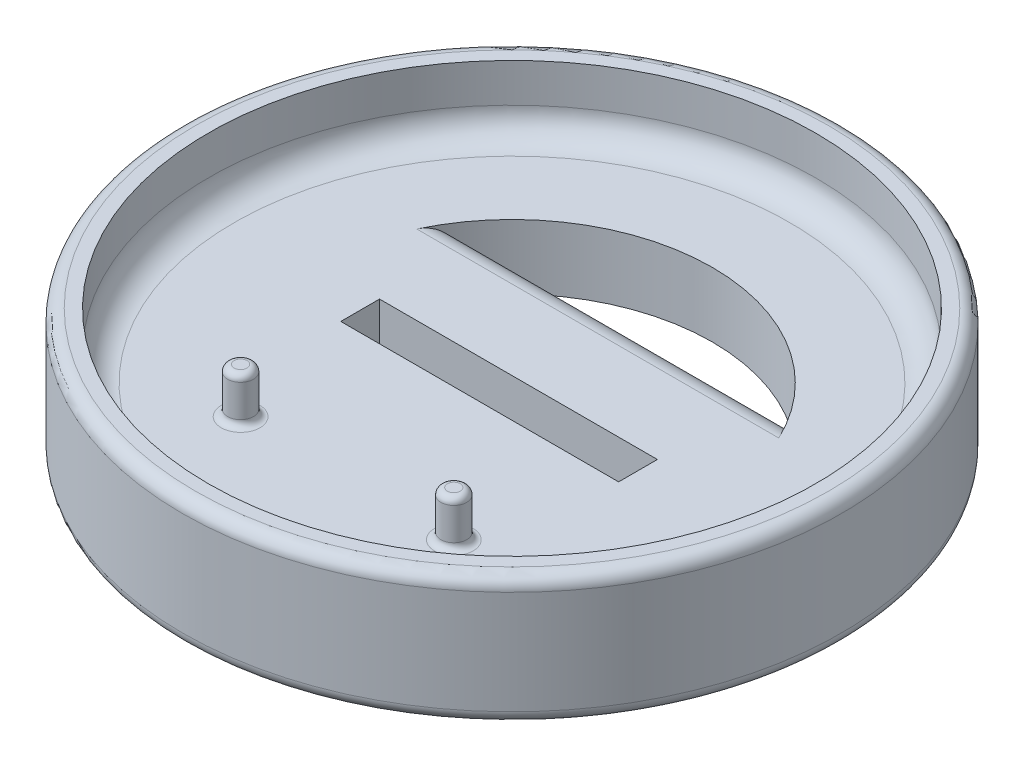
ISO-10303-21;
HEADER;
FILE_DESCRIPTION(('STEP AP214'),'2;1');
FILE_NAME('part.step','',(''),(''),'','','');
FILE_SCHEMA(('AUTOMOTIVE_DESIGN { 1 0 10303 214 1 1 1 1 }'));
ENDSEC;
DATA;
#1=APPLICATION_CONTEXT('core data for automotive mechanical design processes');
#2=APPLICATION_PROTOCOL_DEFINITION('international standard','automotive_design',2000,#1);
#3=PRODUCT_CONTEXT('',#1,'mechanical');
#4=PRODUCT('Part','Part','',(#3));
#5=PRODUCT_RELATED_PRODUCT_CATEGORY('part','',(#4));
#6=PRODUCT_DEFINITION_FORMATION('','',#4);
#7=PRODUCT_DEFINITION_CONTEXT('part definition',#1,'design');
#8=PRODUCT_DEFINITION('design','',#6,#7);
#9=PRODUCT_DEFINITION_SHAPE('','',#8);
#10=(LENGTH_UNIT() NAMED_UNIT(*) SI_UNIT(.MILLI.,.METRE.));
#11=(NAMED_UNIT(*) PLANE_ANGLE_UNIT() SI_UNIT($,.RADIAN.));
#12=(NAMED_UNIT(*) SI_UNIT($,.STERADIAN.) SOLID_ANGLE_UNIT());
#13=UNCERTAINTY_MEASURE_WITH_UNIT(LENGTH_MEASURE(1.E-05),#10,'distance_accuracy_value','');
#14=(GEOMETRIC_REPRESENTATION_CONTEXT(3) GLOBAL_UNCERTAINTY_ASSIGNED_CONTEXT((#13)) GLOBAL_UNIT_ASSIGNED_CONTEXT((#10,
#11,#12)) REPRESENTATION_CONTEXT('',''));
#15=CARTESIAN_POINT('',(0.,0.,0.));
#16=DIRECTION('',(0.,0.,1.));
#17=DIRECTION('',(1.,0.,0.));
#18=AXIS2_PLACEMENT_3D('',#15,#16,#17);
#19=CARTESIAN_POINT('',(0.,5.,0.));
#20=DIRECTION('',(0.,1.,0.));
#21=DIRECTION('',(0.,0.,1.));
#22=AXIS2_PLACEMENT_3D('',#19,#20,#21);
#23=PLANE('',#22);
#24=CARTESIAN_POINT('',(-8.25,5.,12.75));
#25=DIRECTION('',(0.,1.,0.));
#26=DIRECTION('',(0.,0.,1.));
#27=AXIS2_PLACEMENT_3D('',#24,#25,#26);
#28=CIRCLE('',#27,1.5);
#29=CARTESIAN_POINT('',(-8.25,5.,14.25));
#30=VERTEX_POINT('',#29);
#31=EDGE_CURVE('E451',#30,#30,#28,.F.);
#32=ORIENTED_EDGE('',*,*,#31,.T.);
#33=EDGE_LOOP('',(#32));
#34=FACE_BOUND('',#33,.T.);
#35=CARTESIAN_POINT('',(8.25,5.,12.75));
#36=DIRECTION('',(0.,1.,0.));
#37=DIRECTION('',(0.,0.,1.));
#38=AXIS2_PLACEMENT_3D('',#35,#36,#37);
#39=CIRCLE('',#38,1.5);
#40=CARTESIAN_POINT('',(8.25,5.,14.25));
#41=VERTEX_POINT('',#40);
#42=EDGE_CURVE('E446',#41,#41,#39,.F.);
#43=ORIENTED_EDGE('',*,*,#42,.T.);
#44=EDGE_LOOP('',(#43));
#45=FACE_BOUND('',#44,.T.);
#46=CARTESIAN_POINT('',(0.,5.,0.));
#47=DIRECTION('',(0.,1.,0.));
#48=DIRECTION('',(0.,0.,1.));
#49=AXIS2_PLACEMENT_3D('',#46,#47,#48);
#50=CIRCLE('',#49,21.5);
#51=CARTESIAN_POINT('',(0.,5.,21.5));
#52=VERTEX_POINT('',#51);
#53=EDGE_CURVE('E161',#52,#52,#50,.T.);
#54=ORIENTED_EDGE('',*,*,#53,.T.);
#55=EDGE_LOOP('',(#54));
#56=FACE_BOUND('',#55,.T.);
#57=CARTESIAN_POINT('',(0.,5.,0.));
#58=DIRECTION('',(0.,1.,0.));
#59=DIRECTION('',(0.,0.,1.));
#60=AXIS2_PLACEMENT_3D('',#57,#58,#59);
#61=CIRCLE('',#60,15.5);
#62=CARTESIAN_POINT('',(14.0080112419468,5.,-6.6351805586203));
#63=VERTEX_POINT('',#62);
#64=CARTESIAN_POINT('',(-14.0080112419468,5.,-6.6351805586203));
#65=VERTEX_POINT('',#64);
#66=EDGE_CURVE('E146',#63,#65,#61,.T.);
#67=ORIENTED_EDGE('',*,*,#66,.F.);
#68=DIRECTION('',(1.,0.,0.));
#69=VECTOR('',#68,1.);
#70=CARTESIAN_POINT('',(0.,5.,-6.6351805586203));
#71=LINE('',#70,#69);
#72=EDGE_CURVE('E158',#63,#65,#71,.F.);
#73=ORIENTED_EDGE('',*,*,#72,.T.);
#74=EDGE_LOOP('',(#67,#73));
#75=FACE_BOUND('',#74,.T.);
#76=DIRECTION('',(0.,0.,-1.));
#77=VECTOR('',#76,1.);
#78=CARTESIAN_POINT('',(10.75,5.,0.));
#79=LINE('',#78,#77);
#80=CARTESIAN_POINT('',(10.75,5.,2.5));
#81=VERTEX_POINT('',#80);
#82=CARTESIAN_POINT('',(10.75,5.,-0.500000000000001));
#83=VERTEX_POINT('',#82);
#84=EDGE_CURVE('E133',#81,#83,#79,.T.);
#85=ORIENTED_EDGE('',*,*,#84,.F.);
#86=DIRECTION('',(-1.,0.,0.));
#87=VECTOR('',#86,1.);
#88=CARTESIAN_POINT('',(0.,5.,2.5));
#89=LINE('',#88,#87);
#90=CARTESIAN_POINT('',(-10.75,5.,2.5));
#91=VERTEX_POINT('',#90);
#92=EDGE_CURVE('E56',#81,#91,#89,.T.);
#93=ORIENTED_EDGE('',*,*,#92,.T.);
#94=DIRECTION('',(0.,0.,-1.));
#95=VECTOR('',#94,1.);
#96=CARTESIAN_POINT('',(-10.75,5.,0.));
#97=LINE('',#96,#95);
#98=CARTESIAN_POINT('',(-10.75,5.,-0.499999999999998));
#99=VERTEX_POINT('',#98);
#100=EDGE_CURVE('E124',#91,#99,#97,.T.);
#101=ORIENTED_EDGE('',*,*,#100,.T.);
#102=DIRECTION('',(-1.,0.,0.));
#103=VECTOR('',#102,1.);
#104=CARTESIAN_POINT('',(0.,5.,-0.5));
#105=LINE('',#104,#103);
#106=EDGE_CURVE('E127',#83,#99,#105,.T.);
#107=ORIENTED_EDGE('',*,*,#106,.F.);
#108=EDGE_LOOP('',(#85,#93,#101,#107));
#109=FACE_BOUND('',#108,.T.);
#110=ADVANCED_FACE('F41',(#34,#45,#56,#75,#109),#23,.T.);
#111=CARTESIAN_POINT('',(0.,0.,0.));
#112=DIRECTION('',(0.,1.,0.));
#113=DIRECTION('',(0.,0.,1.));
#114=AXIS2_PLACEMENT_3D('',#111,#112,#113);
#115=PLANE('',#114);
#116=CARTESIAN_POINT('',(0.,0.,0.));
#117=DIRECTION('',(0.,1.,0.));
#118=DIRECTION('',(0.,0.,1.));
#119=AXIS2_PLACEMENT_3D('',#116,#117,#118);
#120=CIRCLE('',#119,24.5);
#121=CARTESIAN_POINT('',(0.,0.,24.5));
#122=VERTEX_POINT('',#121);
#123=EDGE_CURVE('E11',#122,#122,#120,.F.);
#124=ORIENTED_EDGE('',*,*,#123,.T.);
#125=EDGE_LOOP('',(#124));
#126=FACE_BOUND('',#125,.T.);
#127=DIRECTION('',(1.,0.,0.));
#128=VECTOR('',#127,1.);
#129=CARTESIAN_POINT('',(12.8718163722151,0.,-6.6351805586203));
#130=LINE('',#129,#128);
#131=CARTESIAN_POINT('',(-14.0080112419468,0.,-6.6351805586203));
#132=VERTEX_POINT('',#131);
#133=CARTESIAN_POINT('',(14.0080112419468,0.,-6.6351805586203));
#134=VERTEX_POINT('',#133);
#135=EDGE_CURVE('E164',#132,#134,#130,.T.);
#136=ORIENTED_EDGE('',*,*,#135,.T.);
#137=CARTESIAN_POINT('',(0.,0.,0.));
#138=DIRECTION('',(0.,1.,0.));
#139=DIRECTION('',(0.,0.,1.));
#140=AXIS2_PLACEMENT_3D('',#137,#138,#139);
#141=CIRCLE('',#140,15.5);
#142=EDGE_CURVE('E145',#134,#132,#141,.T.);
#143=ORIENTED_EDGE('',*,*,#142,.T.);
#144=EDGE_LOOP('',(#136,#143));
#145=FACE_BOUND('',#144,.T.);
#146=DIRECTION('',(-1.,0.,0.));
#147=VECTOR('',#146,1.);
#148=CARTESIAN_POINT('',(0.,0.,2.5));
#149=LINE('',#148,#147);
#150=CARTESIAN_POINT('',(10.75,0.,2.5));
#151=VERTEX_POINT('',#150);
#152=CARTESIAN_POINT('',(-10.75,0.,2.5));
#153=VERTEX_POINT('',#152);
#154=EDGE_CURVE('E109',#151,#153,#149,.T.);
#155=ORIENTED_EDGE('',*,*,#154,.F.);
#156=DIRECTION('',(0.,0.,-1.));
#157=VECTOR('',#156,1.);
#158=CARTESIAN_POINT('',(10.75,0.,0.));
#159=LINE('',#158,#157);
#160=CARTESIAN_POINT('',(10.75,0.,-0.500000000000001));
#161=VERTEX_POINT('',#160);
#162=EDGE_CURVE('E118',#151,#161,#159,.T.);
#163=ORIENTED_EDGE('',*,*,#162,.T.);
#164=DIRECTION('',(-1.,0.,0.));
#165=VECTOR('',#164,1.);
#166=CARTESIAN_POINT('',(0.,0.,-0.5));
#167=LINE('',#166,#165);
#168=CARTESIAN_POINT('',(-10.75,0.,-0.499999999999998));
#169=VERTEX_POINT('',#168);
#170=EDGE_CURVE('E64',#161,#169,#167,.T.);
#171=ORIENTED_EDGE('',*,*,#170,.T.);
#172=DIRECTION('',(0.,0.,-1.));
#173=VECTOR('',#172,1.);
#174=CARTESIAN_POINT('',(-10.75,0.,0.));
#175=LINE('',#174,#173);
#176=EDGE_CURVE('E115',#153,#169,#175,.T.);
#177=ORIENTED_EDGE('',*,*,#176,.F.);
#178=EDGE_LOOP('',(#155,#163,#171,#177));
#179=FACE_BOUND('',#178,.T.);
#180=ADVANCED_FACE('F123',(#126,#145,#179),#115,.F.);
#181=CARTESIAN_POINT('',(0.,5.,-8.6351805586203));
#182=DIRECTION('',(0.,0.,-1.));
#183=DIRECTION('',(-1.,0.,0.));
#184=AXIS2_PLACEMENT_3D('',#181,#182,#183);
#185=PLANE('',#184);
#186=DIRECTION('',(0.,-1.,0.));
#187=VECTOR('',#186,1.);
#188=CARTESIAN_POINT('',(12.8718163722151,5.,-8.6351805586203));
#189=LINE('',#188,#187);
#190=CARTESIAN_POINT('',(12.8718163722151,3.,-8.6351805586203));
#191=VERTEX_POINT('',#190);
#192=CARTESIAN_POINT('',(12.8718163722151,2.,-8.6351805586203));
#193=VERTEX_POINT('',#192);
#194=EDGE_CURVE('E148',#191,#193,#189,.T.);
#195=ORIENTED_EDGE('',*,*,#194,.T.);
#196=DIRECTION('',(1.,0.,0.));
#197=VECTOR('',#196,1.);
#198=CARTESIAN_POINT('',(-12.8718163722151,2.,-8.6351805586203));
#199=LINE('',#198,#197);
#200=CARTESIAN_POINT('',(-12.8718163722151,2.,-8.6351805586203));
#201=VERTEX_POINT('',#200);
#202=EDGE_CURVE('E170',#193,#201,#199,.F.);
#203=ORIENTED_EDGE('',*,*,#202,.T.);
#204=DIRECTION('',(0.,-1.,0.));
#205=VECTOR('',#204,1.);
#206=CARTESIAN_POINT('',(-12.8718163722151,5.,-8.6351805586203));
#207=LINE('',#206,#205);
#208=CARTESIAN_POINT('',(-12.8718163722151,3.,-8.6351805586203));
#209=VERTEX_POINT('',#208);
#210=EDGE_CURVE('E152',#209,#201,#207,.T.);
#211=ORIENTED_EDGE('',*,*,#210,.F.);
#212=DIRECTION('',(1.,0.,0.));
#213=VECTOR('',#212,1.);
#214=CARTESIAN_POINT('',(0.,3.,-8.6351805586203));
#215=LINE('',#214,#213);
#216=EDGE_CURVE('E167',#209,#191,#215,.T.);
#217=ORIENTED_EDGE('',*,*,#216,.T.);
#218=EDGE_LOOP('',(#195,#203,#211,#217));
#219=FACE_BOUND('',#218,.T.);
#220=ADVANCED_FACE('F196',(#219),#185,.T.);
#221=CARTESIAN_POINT('',(0.,5.,0.));
#222=DIRECTION('',(0.,-1.,0.));
#223=DIRECTION('',(0.,0.,-1.));
#224=AXIS2_PLACEMENT_3D('',#221,#222,#223);
#225=CYLINDRICAL_SURFACE('',#224,15.5);
#226=ORIENTED_EDGE('',*,*,#142,.F.);
#227=CARTESIAN_POINT('',(14.0080112419468,0.,-6.6351805586203));
#228=CARTESIAN_POINT('',(13.9781206290154,4.21945147258445E-06,-6.69829090336129));
#229=CARTESIAN_POINT('',(13.9478158055815,0.00298799475050054,-6.76115981054807));
#230=CARTESIAN_POINT('',(13.8865912124818,0.0148015338495115,-6.8860298619537));
#231=CARTESIAN_POINT('',(13.8556715574973,0.0236302171704366,-6.94803116439367));
#232=CARTESIAN_POINT('',(13.7623144733947,0.0587078426554312,-7.13215029882441));
#233=CARTESIAN_POINT('',(13.6992585885515,0.0935485155013303,-7.2524262075691));
#234=CARTESIAN_POINT('',(13.5737999522414,0.185045832755223,-7.48461141225801));
#235=CARTESIAN_POINT('',(13.5113970355795,0.24169681522057,-7.59652287061201));
#236=CARTESIAN_POINT('',(13.3896603213025,0.375897013976576,-7.80909665840873));
#237=CARTESIAN_POINT('',(13.330327787042,0.453454752436903,-7.90975437679276));
#238=CARTESIAN_POINT('',(13.2187450850758,0.626951926658413,-8.09483035019676));
#239=CARTESIAN_POINT('',(13.16639549298,0.722572165833325,-8.17948592520051));
#240=CARTESIAN_POINT('',(13.0713003849889,0.931343997646204,-8.33061143809802));
#241=CARTESIAN_POINT('',(13.0285359210506,1.04446024178666,-8.39711731230873));
#242=CARTESIAN_POINT('',(12.9666226161699,1.25147225337741,-8.49228935337921));
#243=CARTESIAN_POINT('',(12.9442137287211,1.34194813613629,-8.52633551960424));
#244=CARTESIAN_POINT('',(12.9079150061834,1.52837614702328,-8.58119030392472));
#245=CARTESIAN_POINT('',(12.8940067685859,1.62431595054388,-8.60202752088589));
#246=CARTESIAN_POINT('',(12.8805319901656,1.76759510873513,-8.62217768949923));
#247=CARTESIAN_POINT('',(12.8772702052673,1.81388382771661,-8.62704667868417));
#248=CARTESIAN_POINT('',(12.8729114513913,1.90677331951099,-8.63354846325024));
#249=CARTESIAN_POINT('',(12.8718137597019,1.95337398292987,-8.63518233901713));
#250=CARTESIAN_POINT('',(12.8718163722151,2.,-8.6351805586203));
#251=B_SPLINE_CURVE_WITH_KNOTS('',3,(#227,#228,#229,#230,#231,#232,#233,#234,#235,#236,#237,
#238,#239,#240,#241,#242,#243,#244,#245,#246,#247,#248,#249,#250),.UNSPECIFIED.,.F.,.F.,(4,2,2,
2,2,2,2,2,2,2,2,4),(0.,0.209350899057412,0.418663108690789,0.837147046651901,1.25552241962056,
1.6740685924817,2.0858131114055,2.49673636375697,2.79322465098015,3.08906879515592,
3.22890283369302,3.36869016592201),.UNSPECIFIED.);
#252=EDGE_CURVE('E172',#134,#193,#251,.T.);
#253=ORIENTED_EDGE('',*,*,#252,.T.);
#254=ORIENTED_EDGE('',*,*,#194,.F.);
#255=CARTESIAN_POINT('',(12.8718163722151,3.,-8.6351805586203));
#256=CARTESIAN_POINT('',(12.8718074826729,3.04996771756322,-8.63519018594349));
#257=CARTESIAN_POINT('',(12.8730723551207,3.09992872611821,-8.63330827801529));
#258=CARTESIAN_POINT('',(12.8780819825047,3.19942295839131,-8.62583568363618));
#259=CARTESIAN_POINT('',(12.8818254874651,3.2489563849907,-8.62024686657914));
#260=CARTESIAN_POINT('',(12.8916968485421,3.34695410908664,-8.60547652751165));
#261=CARTESIAN_POINT('',(12.8978110892938,3.39542287102335,-8.59631551927008));
#262=CARTESIAN_POINT('',(12.9122976591479,3.49122350706627,-8.5745402077349));
#263=CARTESIAN_POINT('',(12.9206701728313,3.53855528789625,-8.5619256221603));
#264=CARTESIAN_POINT('',(12.9489240337867,3.67820650916025,-8.51918658876234));
#265=CARTESIAN_POINT('',(12.9719686028947,3.76843790913809,-8.48412721215402));
#266=CARTESIAN_POINT('',(13.0250388375785,3.94129041344992,-8.40242377101058));
#267=CARTESIAN_POINT('',(13.0550736188603,4.02390138209368,-8.355764574066));
#268=CARTESIAN_POINT('',(13.123012684542,4.18605047292762,-8.24868713154989));
#269=CARTESIAN_POINT('',(13.1613351027012,4.2649076595054,-8.18750569971864));
#270=CARTESIAN_POINT('',(13.2424947264562,4.41145555142505,-8.05557807090399));
#271=CARTESIAN_POINT('',(13.2853334852805,4.47914239447447,-7.98482858095951));
#272=CARTESIAN_POINT('',(13.3811162376946,4.61268210644289,-7.82341753258327));
#273=CARTESIAN_POINT('',(13.4345798837895,4.67650541677285,-7.73138161914735));
#274=CARTESIAN_POINT('',(13.5435246881819,4.78763504852735,-7.5389122134846));
#275=CARTESIAN_POINT('',(13.5990070154768,4.8349316258374,-7.43847381027717));
#276=CARTESIAN_POINT('',(13.7144115540882,4.91515109754185,-7.22362813051862));
#277=CARTESIAN_POINT('',(13.7743601840783,4.94676096643472,-7.10873677462031));
#278=CARTESIAN_POINT('',(13.863112549561,4.97857727059504,-6.93314110317693));
#279=CARTESIAN_POINT('',(13.8925090051789,4.98658300662803,-6.87405044603946));
#280=CARTESIAN_POINT('',(13.9507323828671,4.99729272149934,-6.75510613126724));
#281=CARTESIAN_POINT('',(13.9795592442162,4.99999613807202,-6.69525239339158));
#282=CARTESIAN_POINT('',(14.0080112419468,5.,-6.6351805586203));
#283=B_SPLINE_CURVE_WITH_KNOTS('',3,(#255,#256,#257,#258,#259,#260,#261,#262,#263,#264,#265,
#266,#267,#268,#269,#270,#271,#272,#273,#274,#275,#276,#277,#278,#279,#280,#281,#282),
.UNSPECIFIED.,.F.,.F.,(4,2,2,2,2,2,2,2,2,2,2,2,2,4),(0.,0.149840668847297,0.299605830456959,
0.448523320525301,0.597452986123199,0.894540771956968,1.19201817276935,1.51153158896255,
1.83115525067991,2.20196411292697,2.5729912355774,2.97130714984862,3.17056791402985,
3.36984980696912),.UNSPECIFIED.);
#284=EDGE_CURVE('E203',#191,#63,#283,.T.);
#285=ORIENTED_EDGE('',*,*,#284,.T.);
#286=ORIENTED_EDGE('',*,*,#66,.T.);
#287=CARTESIAN_POINT('',(-14.0080112419468,5.,-6.6351805586203));
#288=CARTESIAN_POINT('',(-13.9781206290154,4.99999578054853,-6.69829090336129));
#289=CARTESIAN_POINT('',(-13.9478158055815,4.9970120052495,-6.76115981054807));
#290=CARTESIAN_POINT('',(-13.8865912124818,4.98519846615049,-6.8860298619537));
#291=CARTESIAN_POINT('',(-13.8556715574973,4.97636978282956,-6.94803116439367));
#292=CARTESIAN_POINT('',(-13.7623144733947,4.94129215734457,-7.13215029882441));
#293=CARTESIAN_POINT('',(-13.6992585885515,4.90645148449867,-7.2524262075691));
#294=CARTESIAN_POINT('',(-13.5737999522414,4.81495416724478,-7.48461141225801));
#295=CARTESIAN_POINT('',(-13.5113970355795,4.75830318477943,-7.59652287061201));
#296=CARTESIAN_POINT('',(-13.3896603213025,4.62410298602343,-7.80909665840873));
#297=CARTESIAN_POINT('',(-13.330327787042,4.5465452475631,-7.90975437679276));
#298=CARTESIAN_POINT('',(-13.2187450850758,4.37304807334159,-8.09483035019676));
#299=CARTESIAN_POINT('',(-13.16639549298,4.27742783416668,-8.17948592520052));
#300=CARTESIAN_POINT('',(-13.0713003849889,4.0686560023538,-8.33061143809802));
#301=CARTESIAN_POINT('',(-13.0285359210506,3.95553975821334,-8.39711731230873));
#302=CARTESIAN_POINT('',(-12.9666226161699,3.74852774662259,-8.49228935337921));
#303=CARTESIAN_POINT('',(-12.9442137287211,3.65805186386371,-8.52633551960424));
#304=CARTESIAN_POINT('',(-12.9079150061834,3.47162385297672,-8.58119030392472));
#305=CARTESIAN_POINT('',(-12.8940067685859,3.37568404945612,-8.60202752088589));
#306=CARTESIAN_POINT('',(-12.8805319901656,3.23240489126487,-8.62217768949923));
#307=CARTESIAN_POINT('',(-12.8772702052673,3.18611617228339,-8.62704667868417));
#308=CARTESIAN_POINT('',(-12.8729114513913,3.09322668048901,-8.63354846325024));
#309=CARTESIAN_POINT('',(-12.8718137597019,3.04662601707013,-8.63518233901713));
#310=CARTESIAN_POINT('',(-12.8718163722151,3.,-8.6351805586203));
#311=B_SPLINE_CURVE_WITH_KNOTS('',3,(#287,#288,#289,#290,#291,#292,#293,#294,#295,#296,#297,
#298,#299,#300,#301,#302,#303,#304,#305,#306,#307,#308,#309,#310),.UNSPECIFIED.,.F.,.F.,(4,2,2,
2,2,2,2,2,2,2,2,4),(0.,0.209350899057412,0.418663108690789,0.8371470466519,1.25552241962056,
1.6740685924817,2.0858131114055,2.49673636375697,2.79322465098015,3.08906879515592,
3.22890283369301,3.36869016592201),.UNSPECIFIED.);
#312=EDGE_CURVE('E209',#65,#209,#311,.T.);
#313=ORIENTED_EDGE('',*,*,#312,.T.);
#314=ORIENTED_EDGE('',*,*,#210,.T.);
#315=CARTESIAN_POINT('',(-12.8718163722151,2.,-8.6351805586203));
#316=CARTESIAN_POINT('',(-12.8718074826729,1.95003228243678,-8.63519018594349));
#317=CARTESIAN_POINT('',(-12.8730723551207,1.90007127388179,-8.63330827801529));
#318=CARTESIAN_POINT('',(-12.8780819825047,1.80057704160869,-8.62583568363618));
#319=CARTESIAN_POINT('',(-12.8818254874651,1.75104361500931,-8.62024686657914));
#320=CARTESIAN_POINT('',(-12.8916968485421,1.65304589091336,-8.60547652751165));
#321=CARTESIAN_POINT('',(-12.8978110892938,1.60457712897665,-8.59631551927008));
#322=CARTESIAN_POINT('',(-12.9122976591479,1.50877649293373,-8.5745402077349));
#323=CARTESIAN_POINT('',(-12.9206701728313,1.46144471210375,-8.5619256221603));
#324=CARTESIAN_POINT('',(-12.9489240337867,1.32179349083975,-8.51918658876234));
#325=CARTESIAN_POINT('',(-12.9719686028947,1.23156209086191,-8.48412721215402));
#326=CARTESIAN_POINT('',(-13.0250388375785,1.05870958655009,-8.40242377101058));
#327=CARTESIAN_POINT('',(-13.0550736188603,0.976098617906321,-8.355764574066));
#328=CARTESIAN_POINT('',(-13.123012684542,0.813949527072379,-8.24868713154989));
#329=CARTESIAN_POINT('',(-13.1613351027012,0.735092340494597,-8.18750569971864));
#330=CARTESIAN_POINT('',(-13.2424947264562,0.588544448574953,-8.05557807090399));
#331=CARTESIAN_POINT('',(-13.2853334852805,0.520857605525528,-7.98482858095951));
#332=CARTESIAN_POINT('',(-13.3811162376946,0.387317893557104,-7.82341753258327));
#333=CARTESIAN_POINT('',(-13.4345798837895,0.323494583227146,-7.73138161914735));
#334=CARTESIAN_POINT('',(-13.5435246881819,0.212364951472653,-7.5389122134846));
#335=CARTESIAN_POINT('',(-13.5990070154768,0.165068374162603,-7.43847381027717));
#336=CARTESIAN_POINT('',(-13.7144115540882,0.0848489024581547,-7.22362813051862));
#337=CARTESIAN_POINT('',(-13.7743601840783,0.0532390335652805,-7.10873677462031));
#338=CARTESIAN_POINT('',(-13.863112549561,0.0214227294049593,-6.93314110317693));
#339=CARTESIAN_POINT('',(-13.8925090051789,0.0134169933719701,-6.87405044603946));
#340=CARTESIAN_POINT('',(-13.9507323828671,0.00270727850066037,-6.75510613126724));
#341=CARTESIAN_POINT('',(-13.9795592442162,3.86192797955486E-06,-6.69525239339158));
#342=CARTESIAN_POINT('',(-14.0080112419468,0.,-6.6351805586203));
#343=B_SPLINE_CURVE_WITH_KNOTS('',3,(#315,#316,#317,#318,#319,#320,#321,#322,#323,#324,#325,
#326,#327,#328,#329,#330,#331,#332,#333,#334,#335,#336,#337,#338,#339,#340,#341,#342),
.UNSPECIFIED.,.F.,.F.,(4,2,2,2,2,2,2,2,2,2,2,2,2,4),(0.,0.149840668847297,0.299605830456959,
0.448523320525301,0.597452986123199,0.894540771956967,1.19201817276935,1.51153158896255,
1.83115525067991,2.20196411292697,2.5729912355774,2.97130714984862,3.17056791402985,
3.36984980696912),.UNSPECIFIED.);
#344=EDGE_CURVE('E180',#201,#132,#343,.T.);
#345=ORIENTED_EDGE('',*,*,#344,.T.);
#346=EDGE_LOOP('',(#226,#253,#254,#285,#286,#313,#314,#345));
#347=FACE_BOUND('',#346,.T.);
#348=ADVANCED_FACE('F190',(#347),#225,.F.);
#349=CARTESIAN_POINT('',(0.,5.,0.));
#350=DIRECTION('',(0.,-1.,0.));
#351=DIRECTION('',(0.,0.,-1.));
#352=AXIS2_PLACEMENT_3D('',#349,#350,#351);
#353=CYLINDRICAL_SURFACE('',#352,25.5);
#354=CARTESIAN_POINT('',(0.,9.,0.));
#355=DIRECTION('',(0.,1.,0.));
#356=DIRECTION('',(0.,0.,1.));
#357=AXIS2_PLACEMENT_3D('',#354,#355,#356);
#358=CIRCLE('',#357,25.5);
#359=CARTESIAN_POINT('',(0.,9.,25.5));
#360=VERTEX_POINT('',#359);
#361=EDGE_CURVE('E49',#360,#360,#358,.F.);
#362=ORIENTED_EDGE('',*,*,#361,.T.);
#363=EDGE_LOOP('',(#362));
#364=FACE_BOUND('',#363,.T.);
#365=CARTESIAN_POINT('',(0.,1.,0.));
#366=DIRECTION('',(0.,1.,0.));
#367=DIRECTION('',(0.,0.,1.));
#368=AXIS2_PLACEMENT_3D('',#365,#366,#367);
#369=CIRCLE('',#368,25.5);
#370=CARTESIAN_POINT('',(0.,1.,25.5));
#371=VERTEX_POINT('',#370);
#372=EDGE_CURVE('E309',#371,#371,#369,.T.);
#373=ORIENTED_EDGE('',*,*,#372,.T.);
#374=EDGE_LOOP('',(#373));
#375=FACE_BOUND('',#374,.T.);
#376=ADVANCED_FACE('F195',(#364,#375),#353,.T.);
#377=CARTESIAN_POINT('',(0.,10.,0.));
#378=DIRECTION('',(0.,1.,0.));
#379=DIRECTION('',(0.,0.,1.));
#380=AXIS2_PLACEMENT_3D('',#377,#378,#379);
#381=PLANE('',#380);
#382=CARTESIAN_POINT('',(0.,10.,0.));
#383=DIRECTION('',(0.,1.,0.));
#384=DIRECTION('',(0.,0.,1.));
#385=AXIS2_PLACEMENT_3D('',#382,#383,#384);
#386=CIRCLE('',#385,24.5);
#387=CARTESIAN_POINT('',(0.,10.,24.5));
#388=VERTEX_POINT('',#387);
#389=EDGE_CURVE('E300',#388,#388,#386,.T.);
#390=ORIENTED_EDGE('',*,*,#389,.T.);
#391=EDGE_LOOP('',(#390));
#392=FACE_BOUND('',#391,.T.);
#393=CARTESIAN_POINT('',(0.,10.,0.));
#394=DIRECTION('',(0.,1.,0.));
#395=DIRECTION('',(0.,0.,1.));
#396=AXIS2_PLACEMENT_3D('',#393,#394,#395);
#397=CIRCLE('',#396,23.5);
#398=CARTESIAN_POINT('',(0.,10.,23.5));
#399=VERTEX_POINT('',#398);
#400=EDGE_CURVE('E139',#399,#399,#397,.T.);
#401=ORIENTED_EDGE('',*,*,#400,.F.);
#402=EDGE_LOOP('',(#401));
#403=FACE_BOUND('',#402,.T.);
#404=ADVANCED_FACE('F259',(#392,#403),#381,.T.);
#405=CARTESIAN_POINT('',(0.,10.,0.));
#406=DIRECTION('',(0.,-1.,0.));
#407=DIRECTION('',(0.,0.,-1.));
#408=AXIS2_PLACEMENT_3D('',#405,#406,#407);
#409=CYLINDRICAL_SURFACE('',#408,23.5);
#410=CARTESIAN_POINT('',(0.,7.,0.));
#411=DIRECTION('',(0.,1.,0.));
#412=DIRECTION('',(0.,0.,1.));
#413=AXIS2_PLACEMENT_3D('',#410,#411,#412);
#414=CIRCLE('',#413,23.5);
#415=CARTESIAN_POINT('',(0.,7.,23.5));
#416=VERTEX_POINT('',#415);
#417=EDGE_CURVE('E155',#416,#416,#414,.F.);
#418=ORIENTED_EDGE('',*,*,#417,.T.);
#419=EDGE_LOOP('',(#418));
#420=FACE_BOUND('',#419,.T.);
#421=ORIENTED_EDGE('',*,*,#400,.T.);
#422=EDGE_LOOP('',(#421));
#423=FACE_BOUND('',#422,.T.);
#424=ADVANCED_FACE('F261',(#420,#423),#409,.F.);
#425=CARTESIAN_POINT('',(0.,7.,0.));
#426=DIRECTION('',(0.,1.,0.));
#427=DIRECTION('',(0.,0.,1.));
#428=AXIS2_PLACEMENT_3D('',#425,#426,#427);
#429=TOROIDAL_SURFACE('',#428,21.5,2.);
#430=ORIENTED_EDGE('',*,*,#53,.F.);
#431=EDGE_LOOP('',(#430));
#432=FACE_BOUND('',#431,.T.);
#433=ORIENTED_EDGE('',*,*,#417,.F.);
#434=EDGE_LOOP('',(#433));
#435=FACE_BOUND('',#434,.T.);
#436=ADVANCED_FACE('F265',(#432,#435),#429,.F.);
#437=CARTESIAN_POINT('',(0.,2.,-6.6351805586203));
#438=DIRECTION('',(-1.,0.,0.));
#439=DIRECTION('',(0.,0.,1.));
#440=AXIS2_PLACEMENT_3D('',#437,#438,#439);
#441=CYLINDRICAL_SURFACE('',#440,2.);
#442=ORIENTED_EDGE('',*,*,#344,.F.);
#443=ORIENTED_EDGE('',*,*,#202,.F.);
#444=ORIENTED_EDGE('',*,*,#252,.F.);
#445=ORIENTED_EDGE('',*,*,#135,.F.);
#446=EDGE_LOOP('',(#442,#443,#444,#445));
#447=FACE_BOUND('',#446,.T.);
#448=ADVANCED_FACE('F186',(#447),#441,.T.);
#449=CARTESIAN_POINT('',(0.,3.,-6.6351805586203));
#450=DIRECTION('',(1.,0.,0.));
#451=DIRECTION('',(0.,0.,-1.));
#452=AXIS2_PLACEMENT_3D('',#449,#450,#451);
#453=CYLINDRICAL_SURFACE('',#452,2.);
#454=ORIENTED_EDGE('',*,*,#312,.F.);
#455=ORIENTED_EDGE('',*,*,#72,.F.);
#456=ORIENTED_EDGE('',*,*,#284,.F.);
#457=ORIENTED_EDGE('',*,*,#216,.F.);
#458=EDGE_LOOP('',(#454,#455,#456,#457));
#459=FACE_BOUND('',#458,.T.);
#460=ADVANCED_FACE('F215',(#459),#453,.T.);
#461=CARTESIAN_POINT('',(0.,0.,2.5));
#462=DIRECTION('',(0.,0.,-1.));
#463=DIRECTION('',(-1.,0.,0.));
#464=AXIS2_PLACEMENT_3D('',#461,#462,#463);
#465=PLANE('',#464);
#466=ORIENTED_EDGE('',*,*,#92,.F.);
#467=DIRECTION('',(0.,1.,0.));
#468=VECTOR('',#467,1.);
#469=CARTESIAN_POINT('',(10.75,0.,2.5));
#470=LINE('',#469,#468);
#471=EDGE_CURVE('E105',#151,#81,#470,.T.);
#472=ORIENTED_EDGE('',*,*,#471,.F.);
#473=ORIENTED_EDGE('',*,*,#154,.T.);
#474=DIRECTION('',(0.,1.,0.));
#475=VECTOR('',#474,1.);
#476=CARTESIAN_POINT('',(-10.75,0.,2.5));
#477=LINE('',#476,#475);
#478=EDGE_CURVE('E137',#153,#91,#477,.T.);
#479=ORIENTED_EDGE('',*,*,#478,.T.);
#480=EDGE_LOOP('',(#466,#472,#473,#479));
#481=FACE_BOUND('',#480,.T.);
#482=ADVANCED_FACE('F107',(#481),#465,.T.);
#483=CARTESIAN_POINT('',(-10.75,0.,0.));
#484=DIRECTION('',(1.,0.,0.));
#485=DIRECTION('',(0.,0.,-1.));
#486=AXIS2_PLACEMENT_3D('',#483,#484,#485);
#487=PLANE('',#486);
#488=ORIENTED_EDGE('',*,*,#100,.F.);
#489=ORIENTED_EDGE('',*,*,#478,.F.);
#490=ORIENTED_EDGE('',*,*,#176,.T.);
#491=DIRECTION('',(0.,1.,0.));
#492=VECTOR('',#491,1.);
#493=CARTESIAN_POINT('',(-10.75,0.,-0.499999999999998));
#494=LINE('',#493,#492);
#495=EDGE_CURVE('E140',#169,#99,#494,.T.);
#496=ORIENTED_EDGE('',*,*,#495,.T.);
#497=EDGE_LOOP('',(#488,#489,#490,#496));
#498=FACE_BOUND('',#497,.T.);
#499=ADVANCED_FACE('F269',(#498),#487,.T.);
#500=CARTESIAN_POINT('',(0.,0.,-0.5));
#501=DIRECTION('',(0.,0.,-1.));
#502=DIRECTION('',(-1.,0.,0.));
#503=AXIS2_PLACEMENT_3D('',#500,#501,#502);
#504=PLANE('',#503);
#505=ORIENTED_EDGE('',*,*,#106,.T.);
#506=ORIENTED_EDGE('',*,*,#495,.F.);
#507=ORIENTED_EDGE('',*,*,#170,.F.);
#508=DIRECTION('',(0.,1.,0.));
#509=VECTOR('',#508,1.);
#510=CARTESIAN_POINT('',(10.75,0.,-0.500000000000001));
#511=LINE('',#510,#509);
#512=EDGE_CURVE('E114',#161,#83,#511,.T.);
#513=ORIENTED_EDGE('',*,*,#512,.T.);
#514=EDGE_LOOP('',(#505,#506,#507,#513));
#515=FACE_BOUND('',#514,.T.);
#516=ADVANCED_FACE('F272',(#515),#504,.F.);
#517=CARTESIAN_POINT('',(10.75,0.,0.));
#518=DIRECTION('',(1.,0.,0.));
#519=DIRECTION('',(0.,0.,-1.));
#520=AXIS2_PLACEMENT_3D('',#517,#518,#519);
#521=PLANE('',#520);
#522=ORIENTED_EDGE('',*,*,#84,.T.);
#523=ORIENTED_EDGE('',*,*,#512,.F.);
#524=ORIENTED_EDGE('',*,*,#162,.F.);
#525=ORIENTED_EDGE('',*,*,#471,.T.);
#526=EDGE_LOOP('',(#522,#523,#524,#525));
#527=FACE_BOUND('',#526,.T.);
#528=ADVANCED_FACE('F119',(#527),#521,.F.);
#529=CARTESIAN_POINT('',(8.25,8.5,12.75));
#530=DIRECTION('',(0.,-1.,0.));
#531=DIRECTION('',(0.,0.,-1.));
#532=AXIS2_PLACEMENT_3D('',#529,#530,#531);
#533=CYLINDRICAL_SURFACE('',#532,1.);
#534=CARTESIAN_POINT('',(8.25,5.5,12.75));
#535=DIRECTION('',(0.,1.,0.));
#536=DIRECTION('',(0.,0.,1.));
#537=AXIS2_PLACEMENT_3D('',#534,#535,#536);
#538=CIRCLE('',#537,1.);
#539=CARTESIAN_POINT('',(8.25,5.5,13.75));
#540=VERTEX_POINT('',#539);
#541=EDGE_CURVE('E297',#540,#540,#538,.T.);
#542=ORIENTED_EDGE('',*,*,#541,.T.);
#543=EDGE_LOOP('',(#542));
#544=FACE_BOUND('',#543,.T.);
#545=CARTESIAN_POINT('',(8.25,8.,12.75));
#546=DIRECTION('',(0.,1.,0.));
#547=DIRECTION('',(0.,0.,1.));
#548=AXIS2_PLACEMENT_3D('',#545,#546,#547);
#549=CIRCLE('',#548,1.);
#550=CARTESIAN_POINT('',(8.25,8.,13.75));
#551=VERTEX_POINT('',#550);
#552=EDGE_CURVE('E303',#551,#551,#549,.F.);
#553=ORIENTED_EDGE('',*,*,#552,.T.);
#554=EDGE_LOOP('',(#553));
#555=FACE_BOUND('',#554,.T.);
#556=ADVANCED_FACE('F271',(#544,#555),#533,.T.);
#557=CARTESIAN_POINT('',(0.,8.5,0.));
#558=DIRECTION('',(0.,1.,0.));
#559=DIRECTION('',(0.,0.,1.));
#560=AXIS2_PLACEMENT_3D('',#557,#558,#559);
#561=PLANE('',#560);
#562=CARTESIAN_POINT('',(8.25,8.5,12.75));
#563=DIRECTION('',(0.,1.,0.));
#564=DIRECTION('',(0.,0.,1.));
#565=AXIS2_PLACEMENT_3D('',#562,#563,#564);
#566=CIRCLE('',#565,0.500000000000002);
#567=CARTESIAN_POINT('',(8.25,8.5,13.25));
#568=VERTEX_POINT('',#567);
#569=EDGE_CURVE('E296',#568,#568,#566,.T.);
#570=ORIENTED_EDGE('',*,*,#569,.T.);
#571=EDGE_LOOP('',(#570));
#572=FACE_BOUND('',#571,.T.);
#573=ADVANCED_FACE('F279',(#572),#561,.T.);
#574=CARTESIAN_POINT('',(-8.25,8.5,12.75));
#575=DIRECTION('',(0.,-1.,0.));
#576=DIRECTION('',(0.,0.,-1.));
#577=AXIS2_PLACEMENT_3D('',#574,#575,#576);
#578=CYLINDRICAL_SURFACE('',#577,1.);
#579=CARTESIAN_POINT('',(-8.25,5.5,12.75));
#580=DIRECTION('',(0.,1.,0.));
#581=DIRECTION('',(0.,0.,1.));
#582=AXIS2_PLACEMENT_3D('',#579,#580,#581);
#583=CIRCLE('',#582,1.);
#584=CARTESIAN_POINT('',(-8.25,5.5,13.75));
#585=VERTEX_POINT('',#584);
#586=EDGE_CURVE('E442',#585,#585,#583,.T.);
#587=ORIENTED_EDGE('',*,*,#586,.T.);
#588=EDGE_LOOP('',(#587));
#589=FACE_BOUND('',#588,.T.);
#590=CARTESIAN_POINT('',(-8.25,8.,12.75));
#591=DIRECTION('',(0.,1.,0.));
#592=DIRECTION('',(0.,0.,1.));
#593=AXIS2_PLACEMENT_3D('',#590,#591,#592);
#594=CIRCLE('',#593,1.);
#595=CARTESIAN_POINT('',(-8.25,8.,13.75));
#596=VERTEX_POINT('',#595);
#597=EDGE_CURVE('E440',#596,#596,#594,.F.);
#598=ORIENTED_EDGE('',*,*,#597,.T.);
#599=EDGE_LOOP('',(#598));
#600=FACE_BOUND('',#599,.T.);
#601=ADVANCED_FACE('F283',(#589,#600),#578,.T.);
#602=CARTESIAN_POINT('',(0.,8.5,0.));
#603=DIRECTION('',(0.,1.,0.));
#604=DIRECTION('',(0.,0.,1.));
#605=AXIS2_PLACEMENT_3D('',#602,#603,#604);
#606=PLANE('',#605);
#607=CARTESIAN_POINT('',(-8.25,8.5,12.75));
#608=DIRECTION('',(0.,1.,0.));
#609=DIRECTION('',(0.,0.,1.));
#610=AXIS2_PLACEMENT_3D('',#607,#608,#609);
#611=CIRCLE('',#610,0.5);
#612=CARTESIAN_POINT('',(-8.25,8.5,13.25));
#613=VERTEX_POINT('',#612);
#614=EDGE_CURVE('E294',#613,#613,#611,.T.);
#615=ORIENTED_EDGE('',*,*,#614,.T.);
#616=EDGE_LOOP('',(#615));
#617=FACE_BOUND('',#616,.T.);
#618=ADVANCED_FACE('F225',(#617),#606,.T.);
#619=CARTESIAN_POINT('',(-8.25,5.5,12.75));
#620=DIRECTION('',(0.,1.,0.));
#621=DIRECTION('',(0.,0.,1.));
#622=AXIS2_PLACEMENT_3D('',#619,#620,#621);
#623=TOROIDAL_SURFACE('',#622,1.5,0.5);
#624=ORIENTED_EDGE('',*,*,#31,.F.);
#625=EDGE_LOOP('',(#624));
#626=FACE_BOUND('',#625,.T.);
#627=ORIENTED_EDGE('',*,*,#586,.F.);
#628=EDGE_LOOP('',(#627));
#629=FACE_BOUND('',#628,.T.);
#630=ADVANCED_FACE('F220',(#626,#629),#623,.F.);
#631=CARTESIAN_POINT('',(8.25,5.5,12.75));
#632=DIRECTION('',(0.,1.,0.));
#633=DIRECTION('',(0.,0.,1.));
#634=AXIS2_PLACEMENT_3D('',#631,#632,#633);
#635=TOROIDAL_SURFACE('',#634,1.5,0.5);
#636=ORIENTED_EDGE('',*,*,#42,.F.);
#637=EDGE_LOOP('',(#636));
#638=FACE_BOUND('',#637,.T.);
#639=ORIENTED_EDGE('',*,*,#541,.F.);
#640=EDGE_LOOP('',(#639));
#641=FACE_BOUND('',#640,.T.);
#642=ADVANCED_FACE('F224',(#638,#641),#635,.F.);
#643=CARTESIAN_POINT('',(-8.25,8.,12.75));
#644=DIRECTION('',(0.,1.,0.));
#645=DIRECTION('',(0.,0.,1.));
#646=AXIS2_PLACEMENT_3D('',#643,#644,#645);
#647=DEGENERATE_TOROIDAL_SURFACE('',#646,0.5,0.5,.T.);
#648=ORIENTED_EDGE('',*,*,#597,.F.);
#649=EDGE_LOOP('',(#648));
#650=FACE_BOUND('',#649,.T.);
#651=ORIENTED_EDGE('',*,*,#614,.F.);
#652=EDGE_LOOP('',(#651));
#653=FACE_BOUND('',#652,.T.);
#654=ADVANCED_FACE('F229',(#650,#653),#647,.T.);
#655=CARTESIAN_POINT('',(8.25,8.,12.75));
#656=DIRECTION('',(0.,1.,0.));
#657=DIRECTION('',(0.,0.,1.));
#658=AXIS2_PLACEMENT_3D('',#655,#656,#657);
#659=TOROIDAL_SURFACE('',#658,0.500000000000002,0.5);
#660=ORIENTED_EDGE('',*,*,#552,.F.);
#661=EDGE_LOOP('',(#660));
#662=FACE_BOUND('',#661,.T.);
#663=ORIENTED_EDGE('',*,*,#569,.F.);
#664=EDGE_LOOP('',(#663));
#665=FACE_BOUND('',#664,.T.);
#666=ADVANCED_FACE('F233',(#662,#665),#659,.T.);
#667=CARTESIAN_POINT('',(0.,9.,0.));
#668=DIRECTION('',(0.,1.,0.));
#669=DIRECTION('',(0.,0.,1.));
#670=AXIS2_PLACEMENT_3D('',#667,#668,#669);
#671=TOROIDAL_SURFACE('',#670,24.5,1.);
#672=ORIENTED_EDGE('',*,*,#361,.F.);
#673=EDGE_LOOP('',(#672));
#674=FACE_BOUND('',#673,.T.);
#675=ORIENTED_EDGE('',*,*,#389,.F.);
#676=EDGE_LOOP('',(#675));
#677=FACE_BOUND('',#676,.T.);
#678=ADVANCED_FACE('F236',(#674,#677),#671,.T.);
#679=CARTESIAN_POINT('',(0.,1.,0.));
#680=DIRECTION('',(0.,1.,0.));
#681=DIRECTION('',(0.,0.,1.));
#682=AXIS2_PLACEMENT_3D('',#679,#680,#681);
#683=TOROIDAL_SURFACE('',#682,24.5,1.);
#684=ORIENTED_EDGE('',*,*,#123,.F.);
#685=EDGE_LOOP('',(#684));
#686=FACE_BOUND('',#685,.T.);
#687=ORIENTED_EDGE('',*,*,#372,.F.);
#688=EDGE_LOOP('',(#687));
#689=FACE_BOUND('',#688,.T.);
#690=ADVANCED_FACE('F43',(#686,#689),#683,.T.);
#691=CLOSED_SHELL('',(#110,#180,#220,#348,#376,#404,#424,#436,#448,#460,#482,#499,#516,#528,
#556,#573,#601,#618,#630,#642,#654,#666,#678,#690));
#692=MANIFOLD_SOLID_BREP('B2',#691);
#693=ADVANCED_BREP_SHAPE_REPRESENTATION('',(#18,#692),#14);
#694=SHAPE_DEFINITION_REPRESENTATION(#9,#693);
ENDSEC;
END-ISO-10303-21;
